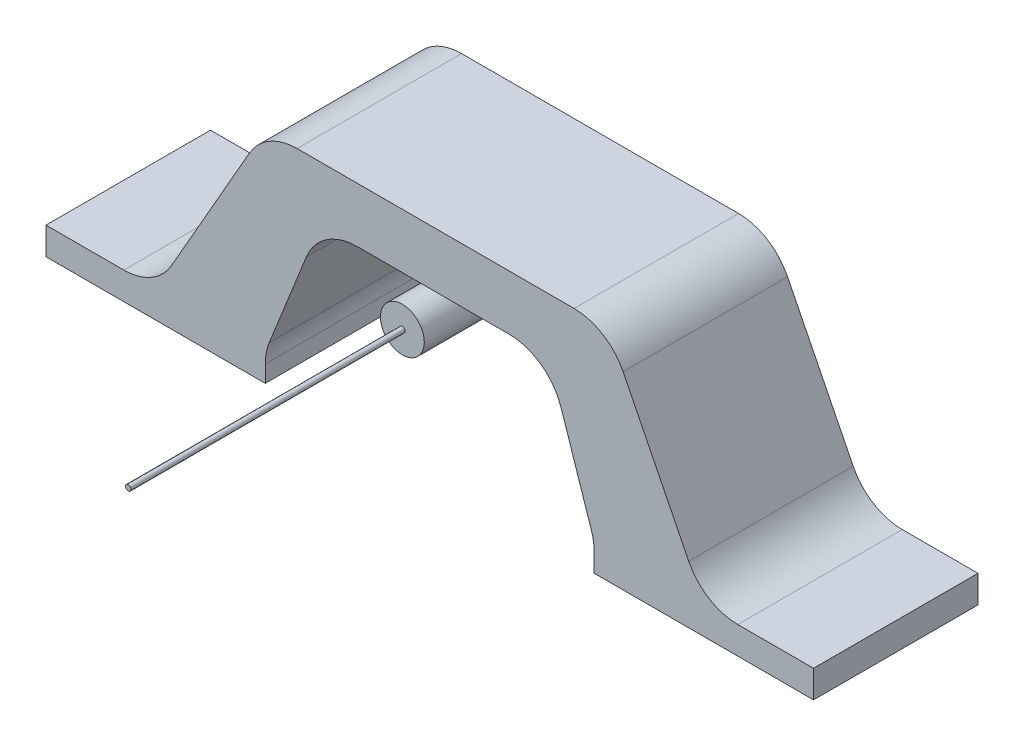
ISO-10303-21;
HEADER;
FILE_DESCRIPTION(('STEP AP214'),'2;1');
FILE_NAME('part.step','',(''),(''),'','','');
FILE_SCHEMA(('AUTOMOTIVE_DESIGN { 1 0 10303 214 1 1 1 1 }'));
ENDSEC;
DATA;
#1=APPLICATION_CONTEXT('core data for automotive mechanical design processes');
#2=APPLICATION_PROTOCOL_DEFINITION('international standard','automotive_design',2000,#1);
#3=PRODUCT_CONTEXT('',#1,'mechanical');
#4=PRODUCT('Part','Part','',(#3));
#5=PRODUCT_RELATED_PRODUCT_CATEGORY('part','',(#4));
#6=PRODUCT_DEFINITION_FORMATION('','',#4);
#7=PRODUCT_DEFINITION_CONTEXT('part definition',#1,'design');
#8=PRODUCT_DEFINITION('design','',#6,#7);
#9=PRODUCT_DEFINITION_SHAPE('','',#8);
#10=(LENGTH_UNIT() NAMED_UNIT(*) SI_UNIT(.MILLI.,.METRE.));
#11=(NAMED_UNIT(*) PLANE_ANGLE_UNIT() SI_UNIT($,.RADIAN.));
#12=(NAMED_UNIT(*) SI_UNIT($,.STERADIAN.) SOLID_ANGLE_UNIT());
#13=UNCERTAINTY_MEASURE_WITH_UNIT(LENGTH_MEASURE(1.E-05),#10,'distance_accuracy_value','');
#14=(GEOMETRIC_REPRESENTATION_CONTEXT(3) GLOBAL_UNCERTAINTY_ASSIGNED_CONTEXT((#13)) GLOBAL_UNIT_ASSIGNED_CONTEXT((#10,
#11,#12)) REPRESENTATION_CONTEXT('',''));
#15=CARTESIAN_POINT('',(0.,0.,0.));
#16=DIRECTION('',(0.,0.,1.));
#17=DIRECTION('',(1.,0.,0.));
#18=AXIS2_PLACEMENT_3D('',#15,#16,#17);
#19=CARTESIAN_POINT('',(0.,26.,35.));
#20=DIRECTION('',(0.,0.,-1.));
#21=DIRECTION('',(-1.,0.,0.));
#22=AXIS2_PLACEMENT_3D('',#19,#20,#21);
#23=CYLINDRICAL_SURFACE('',#22,4.);
#24=CARTESIAN_POINT('',(0.,26.,35.));
#25=DIRECTION('',(0.,0.,1.));
#26=DIRECTION('',(1.,0.,0.));
#27=AXIS2_PLACEMENT_3D('',#24,#25,#26);
#28=CIRCLE('',#27,4.);
#29=CARTESIAN_POINT('',(4.,26.,35.));
#30=VERTEX_POINT('',#29);
#31=EDGE_CURVE('E11',#30,#30,#28,.T.);
#32=ORIENTED_EDGE('',*,*,#31,.F.);
#33=EDGE_LOOP('',(#32));
#34=FACE_BOUND('',#33,.T.);
#35=CARTESIAN_POINT('',(0.,26.,0.));
#36=DIRECTION('',(0.,0.,1.));
#37=DIRECTION('',(1.,0.,0.));
#38=AXIS2_PLACEMENT_3D('',#35,#36,#37);
#39=CIRCLE('',#38,4.);
#40=CARTESIAN_POINT('',(4.,26.,0.));
#41=VERTEX_POINT('',#40);
#42=EDGE_CURVE('E50',#41,#41,#39,.T.);
#43=ORIENTED_EDGE('',*,*,#42,.T.);
#44=EDGE_LOOP('',(#43));
#45=FACE_BOUND('',#44,.T.);
#46=ADVANCED_FACE('F47',(#34,#45),#23,.T.);
#47=CARTESIAN_POINT('',(0.,26.,35.));
#48=DIRECTION('',(0.,0.,1.));
#49=DIRECTION('',(1.,0.,0.));
#50=AXIS2_PLACEMENT_3D('',#47,#48,#49);
#51=PLANE('',#50);
#52=CARTESIAN_POINT('',(0.,26.,35.));
#53=DIRECTION('',(0.,0.,1.));
#54=DIRECTION('',(1.,0.,0.));
#55=AXIS2_PLACEMENT_3D('',#52,#53,#54);
#56=CIRCLE('',#55,0.5);
#57=CARTESIAN_POINT('',(0.5,26.,35.));
#58=VERTEX_POINT('',#57);
#59=EDGE_CURVE('E59',#58,#58,#56,.T.);
#60=ORIENTED_EDGE('',*,*,#59,.F.);
#61=EDGE_LOOP('',(#60));
#62=FACE_BOUND('',#61,.T.);
#63=ORIENTED_EDGE('',*,*,#31,.T.);
#64=EDGE_LOOP('',(#63));
#65=FACE_BOUND('',#64,.T.);
#66=ADVANCED_FACE('F74',(#62,#65),#51,.T.);
#67=CARTESIAN_POINT('',(0.,26.,0.));
#68=DIRECTION('',(0.,0.,1.));
#69=DIRECTION('',(1.,0.,0.));
#70=AXIS2_PLACEMENT_3D('',#67,#68,#69);
#71=PLANE('',#70);
#72=ORIENTED_EDGE('',*,*,#42,.F.);
#73=EDGE_LOOP('',(#72));
#74=FACE_BOUND('',#73,.T.);
#75=ADVANCED_FACE('F70',(#74),#71,.F.);
#76=CARTESIAN_POINT('',(0.,26.,85.));
#77=DIRECTION('',(0.,0.,-1.));
#78=DIRECTION('',(-1.,0.,0.));
#79=AXIS2_PLACEMENT_3D('',#76,#77,#78);
#80=CYLINDRICAL_SURFACE('',#79,0.5);
#81=CARTESIAN_POINT('',(0.,26.,85.));
#82=DIRECTION('',(0.,0.,1.));
#83=DIRECTION('',(1.,0.,0.));
#84=AXIS2_PLACEMENT_3D('',#81,#82,#83);
#85=CIRCLE('',#84,0.5);
#86=CARTESIAN_POINT('',(0.5,26.,85.));
#87=VERTEX_POINT('',#86);
#88=EDGE_CURVE('E57',#87,#87,#85,.T.);
#89=ORIENTED_EDGE('',*,*,#88,.F.);
#90=EDGE_LOOP('',(#89));
#91=FACE_BOUND('',#90,.T.);
#92=ORIENTED_EDGE('',*,*,#59,.T.);
#93=EDGE_LOOP('',(#92));
#94=FACE_BOUND('',#93,.T.);
#95=ADVANCED_FACE('F67',(#91,#94),#80,.T.);
#96=CARTESIAN_POINT('',(0.,26.,85.));
#97=DIRECTION('',(0.,0.,1.));
#98=DIRECTION('',(1.,0.,0.));
#99=AXIS2_PLACEMENT_3D('',#96,#97,#98);
#100=PLANE('',#99);
#101=ORIENTED_EDGE('',*,*,#88,.T.);
#102=EDGE_LOOP('',(#101));
#103=FACE_BOUND('',#102,.T.);
#104=ADVANCED_FACE('F65',(#103),#100,.T.);
#105=CLOSED_SHELL('',(#46,#66,#75,#95,#104));
#106=MANIFOLD_SOLID_BREP('B2',#105);
#107=CARTESIAN_POINT('',(-30.,5.00000000000001,30.));
#108=DIRECTION('',(0.,-1.,0.));
#109=DIRECTION('',(0.,0.,-1.));
#110=AXIS2_PLACEMENT_3D('',#107,#108,#109);
#111=PLANE('',#110);
#112=DIRECTION('',(-1.,0.,0.));
#113=VECTOR('',#112,1.);
#114=CARTESIAN_POINT('',(-30.,5.00000000000001,30.));
#115=LINE('',#114,#113);
#116=CARTESIAN_POINT('',(-55.8032253547122,5.00000000000001,30.));
#117=VERTEX_POINT('',#116);
#118=CARTESIAN_POINT('',(-70.,5.00000000000001,30.));
#119=VERTEX_POINT('',#118);
#120=EDGE_CURVE('E352',#117,#119,#115,.T.);
#121=ORIENTED_EDGE('',*,*,#120,.F.);
#122=DIRECTION('',(0.,0.,-1.));
#123=VECTOR('',#122,1.);
#124=CARTESIAN_POINT('',(-55.8032253547122,5.00000000000001,0.));
#125=LINE('',#124,#123);
#126=CARTESIAN_POINT('',(-55.8032253547122,5.00000000000001,0.));
#127=VERTEX_POINT('',#126);
#128=EDGE_CURVE('E447',#117,#127,#125,.T.);
#129=ORIENTED_EDGE('',*,*,#128,.T.);
#130=DIRECTION('',(-1.,0.,0.));
#131=VECTOR('',#130,1.);
#132=CARTESIAN_POINT('',(-30.,5.00000000000001,0.));
#133=LINE('',#132,#131);
#134=CARTESIAN_POINT('',(-70.,5.00000000000001,0.));
#135=VERTEX_POINT('',#134);
#136=EDGE_CURVE('E366',#127,#135,#133,.T.);
#137=ORIENTED_EDGE('',*,*,#136,.T.);
#138=DIRECTION('',(0.,0.,-1.));
#139=VECTOR('',#138,1.);
#140=CARTESIAN_POINT('',(-70.,5.00000000000001,30.));
#141=LINE('',#140,#139);
#142=EDGE_CURVE('E381',#119,#135,#141,.T.);
#143=ORIENTED_EDGE('',*,*,#142,.F.);
#144=EDGE_LOOP('',(#121,#129,#137,#143));
#145=FACE_BOUND('',#144,.T.);
#146=ADVANCED_FACE('F118',(#145),#111,.F.);
#147=CARTESIAN_POINT('',(-30.,0.,30.));
#148=DIRECTION('',(-1.,0.,0.));
#149=DIRECTION('',(0.,0.,1.));
#150=AXIS2_PLACEMENT_3D('',#147,#148,#149);
#151=PLANE('',#150);
#152=DIRECTION('',(0.,1.,0.));
#153=VECTOR('',#152,1.);
#154=CARTESIAN_POINT('',(-30.,0.,0.));
#155=LINE('',#154,#153);
#156=CARTESIAN_POINT('',(-30.,0.,0.));
#157=VERTEX_POINT('',#156);
#158=CARTESIAN_POINT('',(-30.,3.07417596432749,0.));
#159=VERTEX_POINT('',#158);
#160=EDGE_CURVE('E329',#157,#159,#155,.T.);
#161=ORIENTED_EDGE('',*,*,#160,.T.);
#162=DIRECTION('',(0.,0.,-1.));
#163=VECTOR('',#162,1.);
#164=CARTESIAN_POINT('',(-30.,3.07417596432749,30.));
#165=LINE('',#164,#163);
#166=CARTESIAN_POINT('',(-30.,3.07417596432749,30.));
#167=VERTEX_POINT('',#166);
#168=EDGE_CURVE('E392',#159,#167,#165,.F.);
#169=ORIENTED_EDGE('',*,*,#168,.T.);
#170=DIRECTION('',(0.,1.,0.));
#171=VECTOR('',#170,1.);
#172=CARTESIAN_POINT('',(-30.,0.,30.));
#173=LINE('',#172,#171);
#174=CARTESIAN_POINT('',(-30.,0.,30.));
#175=VERTEX_POINT('',#174);
#176=EDGE_CURVE('E348',#175,#167,#173,.T.);
#177=ORIENTED_EDGE('',*,*,#176,.F.);
#178=DIRECTION('',(0.,0.,-1.));
#179=VECTOR('',#178,1.);
#180=CARTESIAN_POINT('',(-30.,0.,30.));
#181=LINE('',#180,#179);
#182=EDGE_CURVE('E362',#175,#157,#181,.T.);
#183=ORIENTED_EDGE('',*,*,#182,.T.);
#184=EDGE_LOOP('',(#161,#169,#177,#183));
#185=FACE_BOUND('',#184,.T.);
#186=ADVANCED_FACE('F506',(#185),#151,.F.);
#187=CARTESIAN_POINT('',(-70.,0.,30.));
#188=DIRECTION('',(1.,0.,0.));
#189=DIRECTION('',(0.,0.,-1.));
#190=AXIS2_PLACEMENT_3D('',#187,#188,#189);
#191=PLANE('',#190);
#192=DIRECTION('',(0.,-1.,0.));
#193=VECTOR('',#192,1.);
#194=CARTESIAN_POINT('',(-70.,0.,0.));
#195=LINE('',#194,#193);
#196=CARTESIAN_POINT('',(-70.,0.,0.));
#197=VERTEX_POINT('',#196);
#198=EDGE_CURVE('E369',#135,#197,#195,.T.);
#199=ORIENTED_EDGE('',*,*,#198,.T.);
#200=DIRECTION('',(0.,0.,-1.));
#201=VECTOR('',#200,1.);
#202=CARTESIAN_POINT('',(-70.,0.,30.));
#203=LINE('',#202,#201);
#204=CARTESIAN_POINT('',(-70.,0.,30.));
#205=VERTEX_POINT('',#204);
#206=EDGE_CURVE('E377',#205,#197,#203,.T.);
#207=ORIENTED_EDGE('',*,*,#206,.F.);
#208=DIRECTION('',(0.,-1.,0.));
#209=VECTOR('',#208,1.);
#210=CARTESIAN_POINT('',(-70.,0.,30.));
#211=LINE('',#210,#209);
#212=EDGE_CURVE('E356',#119,#205,#211,.T.);
#213=ORIENTED_EDGE('',*,*,#212,.F.);
#214=ORIENTED_EDGE('',*,*,#142,.T.);
#215=EDGE_LOOP('',(#199,#207,#213,#214));
#216=FACE_BOUND('',#215,.T.);
#217=ADVANCED_FACE('F499',(#216),#191,.F.);
#218=CARTESIAN_POINT('',(-30.,0.,30.));
#219=DIRECTION('',(0.,1.,0.));
#220=DIRECTION('',(0.,0.,1.));
#221=AXIS2_PLACEMENT_3D('',#218,#219,#220);
#222=PLANE('',#221);
#223=DIRECTION('',(1.,0.,0.));
#224=VECTOR('',#223,1.);
#225=CARTESIAN_POINT('',(-30.,0.,0.));
#226=LINE('',#225,#224);
#227=EDGE_CURVE('E353',#197,#157,#226,.T.);
#228=ORIENTED_EDGE('',*,*,#227,.T.);
#229=ORIENTED_EDGE('',*,*,#182,.F.);
#230=DIRECTION('',(1.,0.,0.));
#231=VECTOR('',#230,1.);
#232=CARTESIAN_POINT('',(-30.,0.,30.));
#233=LINE('',#232,#231);
#234=EDGE_CURVE('E359',#205,#175,#233,.T.);
#235=ORIENTED_EDGE('',*,*,#234,.F.);
#236=ORIENTED_EDGE('',*,*,#206,.T.);
#237=EDGE_LOOP('',(#228,#229,#235,#236));
#238=FACE_BOUND('',#237,.T.);
#239=ADVANCED_FACE('F502',(#238),#222,.F.);
#240=CARTESIAN_POINT('',(0.,0.,30.));
#241=DIRECTION('',(0.,0.,1.));
#242=DIRECTION('',(1.,0.,0.));
#243=AXIS2_PLACEMENT_3D('',#240,#241,#242);
#244=PLANE('',#243);
#245=DIRECTION('',(-1.,0.,0.));
#246=VECTOR('',#245,1.);
#247=CARTESIAN_POINT('',(32.5,40.,30.));
#248=LINE('',#247,#246);
#249=CARTESIAN_POINT('',(26.319660112501,40.,30.));
#250=VERTEX_POINT('',#249);
#251=CARTESIAN_POINT('',(-24.1967746452878,40.,30.));
#252=VERTEX_POINT('',#251);
#253=EDGE_CURVE('E324',#250,#252,#248,.T.);
#254=ORIENTED_EDGE('',*,*,#253,.T.);
#255=CARTESIAN_POINT('',(-24.1967746452878,30.,30.));
#256=DIRECTION('',(0.,0.,1.));
#257=DIRECTION('',(1.,0.,0.));
#258=AXIS2_PLACEMENT_3D('',#255,#256,#257);
#259=CIRCLE('',#258,10.);
#260=CARTESIAN_POINT('',(-32.8792060665324,34.9613893835683,30.));
#261=VERTEX_POINT('',#260);
#262=EDGE_CURVE('E435',#252,#261,#259,.T.);
#263=ORIENTED_EDGE('',*,*,#262,.T.);
#264=DIRECTION('',(-0.496138938356834,-0.868243142124459,0.));
#265=VECTOR('',#264,1.);
#266=CARTESIAN_POINT('',(-30.,40.,30.));
#267=LINE('',#266,#265);
#268=CARTESIAN_POINT('',(-47.1207939334676,10.0386106164317,30.));
#269=VERTEX_POINT('',#268);
#270=EDGE_CURVE('E327',#261,#269,#267,.T.);
#271=ORIENTED_EDGE('',*,*,#270,.T.);
#272=CARTESIAN_POINT('',(-55.8032253547122,15.,30.));
#273=DIRECTION('',(0.,0.,1.));
#274=DIRECTION('',(1.,0.,0.));
#275=AXIS2_PLACEMENT_3D('',#272,#273,#274);
#276=CIRCLE('',#275,10.);
#277=EDGE_CURVE('E45',#269,#117,#276,.F.);
#278=ORIENTED_EDGE('',*,*,#277,.T.);
#279=ORIENTED_EDGE('',*,*,#120,.T.);
#280=ORIENTED_EDGE('',*,*,#212,.T.);
#281=ORIENTED_EDGE('',*,*,#234,.T.);
#282=ORIENTED_EDGE('',*,*,#176,.T.);
#283=CARTESIAN_POINT('',(-20.,3.07417596432749,30.));
#284=DIRECTION('',(0.,0.,1.));
#285=DIRECTION('',(1.,0.,0.));
#286=AXIS2_PLACEMENT_3D('',#283,#284,#285);
#287=CIRCLE('',#286,10.);
#288=CARTESIAN_POINT('',(-29.2847669088526,6.78808272786853,30.));
#289=VERTEX_POINT('',#288);
#290=EDGE_CURVE('E454',#167,#289,#287,.F.);
#291=ORIENTED_EDGE('',*,*,#290,.T.);
#292=DIRECTION('',(0.371390676354104,0.928476690885259,0.));
#293=VECTOR('',#292,1.);
#294=CARTESIAN_POINT('',(-30.,5.00000000000001,30.));
#295=LINE('',#294,#293);
#296=CARTESIAN_POINT('',(-22.5144372945836,23.713906763541,30.));
#297=VERTEX_POINT('',#296);
#298=EDGE_CURVE('E309',#289,#297,#295,.T.);
#299=ORIENTED_EDGE('',*,*,#298,.T.);
#300=CARTESIAN_POINT('',(-13.229670385731,20.,30.));
#301=DIRECTION('',(0.,0.,1.));
#302=DIRECTION('',(1.,0.,0.));
#303=AXIS2_PLACEMENT_3D('',#300,#301,#302);
#304=CIRCLE('',#303,10.);
#305=CARTESIAN_POINT('',(-13.229670385731,30.,30.));
#306=VERTEX_POINT('',#305);
#307=EDGE_CURVE('E471',#297,#306,#304,.F.);
#308=ORIENTED_EDGE('',*,*,#307,.T.);
#309=DIRECTION('',(1.,0.,0.));
#310=VECTOR('',#309,1.);
#311=CARTESIAN_POINT('',(-20.,30.,30.));
#312=LINE('',#311,#310);
#313=CARTESIAN_POINT('',(14.4590744661054,30.,30.));
#314=VERTEX_POINT('',#313);
#315=EDGE_CURVE('E313',#306,#314,#312,.T.);
#316=ORIENTED_EDGE('',*,*,#315,.T.);
#317=CARTESIAN_POINT('',(14.4590744661054,20.,30.));
#318=DIRECTION('',(0.,0.,1.));
#319=DIRECTION('',(1.,0.,0.));
#320=AXIS2_PLACEMENT_3D('',#317,#318,#319);
#321=CIRCLE('',#320,10.);
#322=CARTESIAN_POINT('',(23.9459074466105,23.1622776601684,30.));
#323=VERTEX_POINT('',#322);
#324=EDGE_CURVE('E465',#314,#323,#321,.F.);
#325=ORIENTED_EDGE('',*,*,#324,.T.);
#326=DIRECTION('',(0.316227766016838,-0.948683298050514,0.));
#327=VECTOR('',#326,1.);
#328=CARTESIAN_POINT('',(21.6666666666667,30.,30.));
#329=LINE('',#328,#327);
#330=CARTESIAN_POINT('',(29.4868329805051,6.5395010584846,30.));
#331=VERTEX_POINT('',#330);
#332=EDGE_CURVE('E318',#323,#331,#329,.T.);
#333=ORIENTED_EDGE('',*,*,#332,.T.);
#334=CARTESIAN_POINT('',(20.,3.37722339831622,30.));
#335=DIRECTION('',(0.,0.,1.));
#336=DIRECTION('',(1.,0.,0.));
#337=AXIS2_PLACEMENT_3D('',#334,#335,#336);
#338=CIRCLE('',#337,10.);
#339=CARTESIAN_POINT('',(30.,3.37722339831622,30.));
#340=VERTEX_POINT('',#339);
#341=EDGE_CURVE('E275',#331,#340,#338,.F.);
#342=ORIENTED_EDGE('',*,*,#341,.T.);
#343=DIRECTION('',(0.,-1.,0.));
#344=VECTOR('',#343,1.);
#345=CARTESIAN_POINT('',(30.,0.,30.));
#346=LINE('',#345,#344);
#347=CARTESIAN_POINT('',(30.,0.,30.));
#348=VERTEX_POINT('',#347);
#349=EDGE_CURVE('E267',#340,#348,#346,.T.);
#350=ORIENTED_EDGE('',*,*,#349,.T.);
#351=DIRECTION('',(1.,0.,0.));
#352=VECTOR('',#351,1.);
#353=CARTESIAN_POINT('',(30.,0.,30.));
#354=LINE('',#353,#352);
#355=CARTESIAN_POINT('',(70.,0.,30.));
#356=VERTEX_POINT('',#355);
#357=EDGE_CURVE('E271',#348,#356,#354,.T.);
#358=ORIENTED_EDGE('',*,*,#357,.T.);
#359=DIRECTION('',(0.,1.,0.));
#360=VECTOR('',#359,1.);
#361=CARTESIAN_POINT('',(70.,0.,30.));
#362=LINE('',#361,#360);
#363=CARTESIAN_POINT('',(70.,5.,30.));
#364=VERTEX_POINT('',#363);
#365=EDGE_CURVE('E291',#356,#364,#362,.T.);
#366=ORIENTED_EDGE('',*,*,#365,.T.);
#367=DIRECTION('',(-1.,0.,0.));
#368=VECTOR('',#367,1.);
#369=CARTESIAN_POINT('',(30.,5.,30.));
#370=LINE('',#369,#368);
#371=CARTESIAN_POINT('',(56.1803398874989,5.,30.));
#372=VERTEX_POINT('',#371);
#373=EDGE_CURVE('E604',#364,#372,#370,.T.);
#374=ORIENTED_EDGE('',*,*,#373,.T.);
#375=CARTESIAN_POINT('',(56.1803398874989,15.,30.));
#376=DIRECTION('',(0.,0.,1.));
#377=DIRECTION('',(1.,0.,0.));
#378=AXIS2_PLACEMENT_3D('',#375,#376,#377);
#379=CIRCLE('',#378,10.);
#380=CARTESIAN_POINT('',(47.2360679774998,10.5278640450004,30.));
#381=VERTEX_POINT('',#380);
#382=EDGE_CURVE('E477',#372,#381,#379,.F.);
#383=ORIENTED_EDGE('',*,*,#382,.T.);
#384=DIRECTION('',(-0.447213595499958,0.894427190999916,0.));
#385=VECTOR('',#384,1.);
#386=CARTESIAN_POINT('',(50.,5.,30.));
#387=LINE('',#386,#385);
#388=CARTESIAN_POINT('',(35.2639320225002,34.4721359549996,30.));
#389=VERTEX_POINT('',#388);
#390=EDGE_CURVE('E321',#381,#389,#387,.T.);
#391=ORIENTED_EDGE('',*,*,#390,.T.);
#392=CARTESIAN_POINT('',(26.319660112501,30.,30.));
#393=DIRECTION('',(0.,0.,1.));
#394=DIRECTION('',(1.,0.,0.));
#395=AXIS2_PLACEMENT_3D('',#392,#393,#394);
#396=CIRCLE('',#395,10.);
#397=EDGE_CURVE('E432',#389,#250,#396,.T.);
#398=ORIENTED_EDGE('',*,*,#397,.T.);
#399=EDGE_LOOP('',(#254,#263,#271,#278,#279,#280,#281,#282,#291,#299,#308,#316,#325,#333,#342,
#350,#358,#366,#374,#383,#391,#398));
#400=FACE_BOUND('',#399,.T.);
#401=ADVANCED_FACE('F270',(#400),#244,.T.);
#402=CARTESIAN_POINT('',(0.,0.,0.));
#403=DIRECTION('',(0.,0.,1.));
#404=DIRECTION('',(1.,0.,0.));
#405=AXIS2_PLACEMENT_3D('',#402,#403,#404);
#406=PLANE('',#405);
#407=DIRECTION('',(-0.496138938356834,-0.868243142124459,0.));
#408=VECTOR('',#407,1.);
#409=CARTESIAN_POINT('',(-30.,40.,0.));
#410=LINE('',#409,#408);
#411=CARTESIAN_POINT('',(-32.8792060665324,34.9613893835683,0.));
#412=VERTEX_POINT('',#411);
#413=CARTESIAN_POINT('',(-47.1207939334676,10.0386106164317,0.));
#414=VERTEX_POINT('',#413);
#415=EDGE_CURVE('E314',#412,#414,#410,.T.);
#416=ORIENTED_EDGE('',*,*,#415,.F.);
#417=CARTESIAN_POINT('',(-24.1967746452878,30.,0.));
#418=DIRECTION('',(0.,0.,1.));
#419=DIRECTION('',(1.,0.,0.));
#420=AXIS2_PLACEMENT_3D('',#417,#418,#419);
#421=CIRCLE('',#420,10.);
#422=CARTESIAN_POINT('',(-24.1967746452878,40.,0.));
#423=VERTEX_POINT('',#422);
#424=EDGE_CURVE('E422',#412,#423,#421,.F.);
#425=ORIENTED_EDGE('',*,*,#424,.T.);
#426=DIRECTION('',(-1.,0.,0.));
#427=VECTOR('',#426,1.);
#428=CARTESIAN_POINT('',(32.5,40.,0.));
#429=LINE('',#428,#427);
#430=CARTESIAN_POINT('',(26.319660112501,40.,0.));
#431=VERTEX_POINT('',#430);
#432=EDGE_CURVE('E341',#431,#423,#429,.T.);
#433=ORIENTED_EDGE('',*,*,#432,.F.);
#434=CARTESIAN_POINT('',(26.319660112501,30.,0.));
#435=DIRECTION('',(0.,0.,1.));
#436=DIRECTION('',(1.,0.,0.));
#437=AXIS2_PLACEMENT_3D('',#434,#435,#436);
#438=CIRCLE('',#437,10.);
#439=CARTESIAN_POINT('',(35.2639320225002,34.4721359549996,0.));
#440=VERTEX_POINT('',#439);
#441=EDGE_CURVE('E419',#431,#440,#438,.F.);
#442=ORIENTED_EDGE('',*,*,#441,.T.);
#443=DIRECTION('',(-0.447213595499958,0.894427190999916,0.));
#444=VECTOR('',#443,1.);
#445=CARTESIAN_POINT('',(50.,5.,0.));
#446=LINE('',#445,#444);
#447=CARTESIAN_POINT('',(47.2360679774998,10.5278640450004,0.));
#448=VERTEX_POINT('',#447);
#449=EDGE_CURVE('E338',#448,#440,#446,.T.);
#450=ORIENTED_EDGE('',*,*,#449,.F.);
#451=CARTESIAN_POINT('',(56.1803398874989,15.,0.));
#452=DIRECTION('',(0.,0.,1.));
#453=DIRECTION('',(1.,0.,0.));
#454=AXIS2_PLACEMENT_3D('',#451,#452,#453);
#455=CIRCLE('',#454,10.);
#456=CARTESIAN_POINT('',(56.1803398874989,5.,0.));
#457=VERTEX_POINT('',#456);
#458=EDGE_CURVE('E474',#448,#457,#455,.T.);
#459=ORIENTED_EDGE('',*,*,#458,.T.);
#460=DIRECTION('',(-1.,0.,0.));
#461=VECTOR('',#460,1.);
#462=CARTESIAN_POINT('',(30.,5.,0.));
#463=LINE('',#462,#461);
#464=CARTESIAN_POINT('',(70.,5.,0.));
#465=VERTEX_POINT('',#464);
#466=EDGE_CURVE('E281',#465,#457,#463,.T.);
#467=ORIENTED_EDGE('',*,*,#466,.F.);
#468=DIRECTION('',(0.,1.,0.));
#469=VECTOR('',#468,1.);
#470=CARTESIAN_POINT('',(70.,0.,0.));
#471=LINE('',#470,#469);
#472=CARTESIAN_POINT('',(70.,0.,0.));
#473=VERTEX_POINT('',#472);
#474=EDGE_CURVE('E597',#473,#465,#471,.T.);
#475=ORIENTED_EDGE('',*,*,#474,.F.);
#476=DIRECTION('',(1.,0.,0.));
#477=VECTOR('',#476,1.);
#478=CARTESIAN_POINT('',(30.,0.,0.));
#479=LINE('',#478,#477);
#480=CARTESIAN_POINT('',(30.,0.,0.));
#481=VERTEX_POINT('',#480);
#482=EDGE_CURVE('E781',#481,#473,#479,.T.);
#483=ORIENTED_EDGE('',*,*,#482,.F.);
#484=DIRECTION('',(0.,-1.,0.));
#485=VECTOR('',#484,1.);
#486=CARTESIAN_POINT('',(30.,0.,0.));
#487=LINE('',#486,#485);
#488=CARTESIAN_POINT('',(30.,3.37722339831622,0.));
#489=VERTEX_POINT('',#488);
#490=EDGE_CURVE('E295',#489,#481,#487,.T.);
#491=ORIENTED_EDGE('',*,*,#490,.F.);
#492=CARTESIAN_POINT('',(20.,3.37722339831622,0.));
#493=DIRECTION('',(0.,0.,1.));
#494=DIRECTION('',(1.,0.,0.));
#495=AXIS2_PLACEMENT_3D('',#492,#493,#494);
#496=CIRCLE('',#495,10.);
#497=CARTESIAN_POINT('',(29.4868329805051,6.5395010584846,0.));
#498=VERTEX_POINT('',#497);
#499=EDGE_CURVE('E457',#489,#498,#496,.T.);
#500=ORIENTED_EDGE('',*,*,#499,.T.);
#501=DIRECTION('',(0.316227766016838,-0.948683298050514,0.));
#502=VECTOR('',#501,1.);
#503=CARTESIAN_POINT('',(21.6666666666667,30.,0.));
#504=LINE('',#503,#502);
#505=CARTESIAN_POINT('',(23.9459074466105,23.1622776601684,0.));
#506=VERTEX_POINT('',#505);
#507=EDGE_CURVE('E334',#506,#498,#504,.T.);
#508=ORIENTED_EDGE('',*,*,#507,.F.);
#509=CARTESIAN_POINT('',(14.4590744661054,20.,0.));
#510=DIRECTION('',(0.,0.,1.));
#511=DIRECTION('',(1.,0.,0.));
#512=AXIS2_PLACEMENT_3D('',#509,#510,#511);
#513=CIRCLE('',#512,10.);
#514=CARTESIAN_POINT('',(14.4590744661054,30.,0.));
#515=VERTEX_POINT('',#514);
#516=EDGE_CURVE('E462',#506,#515,#513,.T.);
#517=ORIENTED_EDGE('',*,*,#516,.T.);
#518=DIRECTION('',(1.,0.,0.));
#519=VECTOR('',#518,1.);
#520=CARTESIAN_POINT('',(-20.,30.,0.));
#521=LINE('',#520,#519);
#522=CARTESIAN_POINT('',(-13.229670385731,30.,0.));
#523=VERTEX_POINT('',#522);
#524=EDGE_CURVE('E303',#523,#515,#521,.T.);
#525=ORIENTED_EDGE('',*,*,#524,.F.);
#526=CARTESIAN_POINT('',(-13.229670385731,20.,0.));
#527=DIRECTION('',(0.,0.,1.));
#528=DIRECTION('',(1.,0.,0.));
#529=AXIS2_PLACEMENT_3D('',#526,#527,#528);
#530=CIRCLE('',#529,10.);
#531=CARTESIAN_POINT('',(-22.5144372945836,23.713906763541,0.));
#532=VERTEX_POINT('',#531);
#533=EDGE_CURVE('E468',#523,#532,#530,.T.);
#534=ORIENTED_EDGE('',*,*,#533,.T.);
#535=DIRECTION('',(0.371390676354104,0.928476690885259,0.));
#536=VECTOR('',#535,1.);
#537=CARTESIAN_POINT('',(-30.,5.00000000000001,0.));
#538=LINE('',#537,#536);
#539=CARTESIAN_POINT('',(-29.2847669088526,6.78808272786853,0.));
#540=VERTEX_POINT('',#539);
#541=EDGE_CURVE('E298',#540,#532,#538,.T.);
#542=ORIENTED_EDGE('',*,*,#541,.F.);
#543=CARTESIAN_POINT('',(-20.,3.07417596432749,0.));
#544=DIRECTION('',(0.,0.,1.));
#545=DIRECTION('',(1.,0.,0.));
#546=AXIS2_PLACEMENT_3D('',#543,#544,#545);
#547=CIRCLE('',#546,10.);
#548=EDGE_CURVE('E451',#540,#159,#547,.T.);
#549=ORIENTED_EDGE('',*,*,#548,.T.);
#550=ORIENTED_EDGE('',*,*,#160,.F.);
#551=ORIENTED_EDGE('',*,*,#227,.F.);
#552=ORIENTED_EDGE('',*,*,#198,.F.);
#553=ORIENTED_EDGE('',*,*,#136,.F.);
#554=CARTESIAN_POINT('',(-55.8032253547122,15.,0.));
#555=DIRECTION('',(0.,0.,1.));
#556=DIRECTION('',(1.,0.,0.));
#557=AXIS2_PLACEMENT_3D('',#554,#555,#556);
#558=CIRCLE('',#557,10.);
#559=EDGE_CURVE('E127',#127,#414,#558,.T.);
#560=ORIENTED_EDGE('',*,*,#559,.T.);
#561=EDGE_LOOP('',(#416,#425,#433,#442,#450,#459,#467,#475,#483,#491,#500,#508,#517,#525,#534,
#542,#549,#550,#551,#552,#553,#560));
#562=FACE_BOUND('',#561,.T.);
#563=ADVANCED_FACE('F483',(#562),#406,.F.);
#564=CARTESIAN_POINT('',(-30.,5.00000000000001,30.));
#565=DIRECTION('',(-0.928476690885259,0.371390676354104,0.));
#566=DIRECTION('',(-0.371390676354104,-0.928476690885259,0.));
#567=AXIS2_PLACEMENT_3D('',#564,#565,#566);
#568=PLANE('',#567);
#569=ORIENTED_EDGE('',*,*,#298,.F.);
#570=DIRECTION('',(0.,0.,-1.));
#571=VECTOR('',#570,1.);
#572=CARTESIAN_POINT('',(-29.2847669088526,6.78808272786853,0.));
#573=LINE('',#572,#571);
#574=EDGE_CURVE('E388',#289,#540,#573,.T.);
#575=ORIENTED_EDGE('',*,*,#574,.T.);
#576=ORIENTED_EDGE('',*,*,#541,.T.);
#577=DIRECTION('',(0.,0.,-1.));
#578=VECTOR('',#577,1.);
#579=CARTESIAN_POINT('',(-22.5144372945836,23.713906763541,30.));
#580=LINE('',#579,#578);
#581=EDGE_CURVE('E385',#532,#297,#580,.F.);
#582=ORIENTED_EDGE('',*,*,#581,.T.);
#583=EDGE_LOOP('',(#569,#575,#576,#582));
#584=FACE_BOUND('',#583,.T.);
#585=ADVANCED_FACE('F515',(#584),#568,.F.);
#586=CARTESIAN_POINT('',(-20.,30.,30.));
#587=DIRECTION('',(0.,1.,0.));
#588=DIRECTION('',(0.,0.,1.));
#589=AXIS2_PLACEMENT_3D('',#586,#587,#588);
#590=PLANE('',#589);
#591=ORIENTED_EDGE('',*,*,#524,.T.);
#592=DIRECTION('',(0.,0.,-1.));
#593=VECTOR('',#592,1.);
#594=CARTESIAN_POINT('',(14.4590744661054,30.,30.));
#595=LINE('',#594,#593);
#596=EDGE_CURVE('E409',#515,#314,#595,.F.);
#597=ORIENTED_EDGE('',*,*,#596,.T.);
#598=ORIENTED_EDGE('',*,*,#315,.F.);
#599=DIRECTION('',(0.,0.,-1.));
#600=VECTOR('',#599,1.);
#601=CARTESIAN_POINT('',(-13.229670385731,30.,0.));
#602=LINE('',#601,#600);
#603=EDGE_CURVE('E405',#306,#523,#602,.T.);
#604=ORIENTED_EDGE('',*,*,#603,.T.);
#605=EDGE_LOOP('',(#591,#597,#598,#604));
#606=FACE_BOUND('',#605,.T.);
#607=ADVANCED_FACE('F524',(#606),#590,.F.);
#608=CARTESIAN_POINT('',(21.6666666666667,30.,30.));
#609=DIRECTION('',(0.948683298050514,0.316227766016838,0.));
#610=DIRECTION('',(-0.316227766016838,0.948683298050514,0.));
#611=AXIS2_PLACEMENT_3D('',#608,#609,#610);
#612=PLANE('',#611);
#613=ORIENTED_EDGE('',*,*,#507,.T.);
#614=DIRECTION('',(0.,0.,-1.));
#615=VECTOR('',#614,1.);
#616=CARTESIAN_POINT('',(29.4868329805051,6.5395010584846,30.));
#617=LINE('',#616,#615);
#618=EDGE_CURVE('E402',#498,#331,#617,.F.);
#619=ORIENTED_EDGE('',*,*,#618,.T.);
#620=ORIENTED_EDGE('',*,*,#332,.F.);
#621=DIRECTION('',(0.,0.,-1.));
#622=VECTOR('',#621,1.);
#623=CARTESIAN_POINT('',(23.9459074466105,23.1622776601684,0.));
#624=LINE('',#623,#622);
#625=EDGE_CURVE('E398',#323,#506,#624,.T.);
#626=ORIENTED_EDGE('',*,*,#625,.T.);
#627=EDGE_LOOP('',(#613,#619,#620,#626));
#628=FACE_BOUND('',#627,.T.);
#629=ADVANCED_FACE('F533',(#628),#612,.F.);
#630=CARTESIAN_POINT('',(50.,5.,30.));
#631=DIRECTION('',(-0.894427190999916,-0.447213595499958,0.));
#632=DIRECTION('',(0.447213595499958,-0.894427190999916,0.));
#633=AXIS2_PLACEMENT_3D('',#630,#631,#632);
#634=PLANE('',#633);
#635=ORIENTED_EDGE('',*,*,#449,.T.);
#636=DIRECTION('',(0.,0.,-1.));
#637=VECTOR('',#636,1.);
#638=CARTESIAN_POINT('',(35.2639320225002,34.4721359549996,30.));
#639=LINE('',#638,#637);
#640=EDGE_CURVE('E140',#440,#389,#639,.F.);
#641=ORIENTED_EDGE('',*,*,#640,.T.);
#642=ORIENTED_EDGE('',*,*,#390,.F.);
#643=DIRECTION('',(0.,0.,-1.));
#644=VECTOR('',#643,1.);
#645=CARTESIAN_POINT('',(47.2360679774998,10.5278640450004,0.));
#646=LINE('',#645,#644);
#647=EDGE_CURVE('E438',#381,#448,#646,.T.);
#648=ORIENTED_EDGE('',*,*,#647,.T.);
#649=EDGE_LOOP('',(#635,#641,#642,#648));
#650=FACE_BOUND('',#649,.T.);
#651=ADVANCED_FACE('F567',(#650),#634,.F.);
#652=CARTESIAN_POINT('',(32.5,40.,30.));
#653=DIRECTION('',(0.,-1.,0.));
#654=DIRECTION('',(1.,0.,0.));
#655=AXIS2_PLACEMENT_3D('',#652,#653,#654);
#656=PLANE('',#655);
#657=ORIENTED_EDGE('',*,*,#432,.T.);
#658=DIRECTION('',(0.,0.,-1.));
#659=VECTOR('',#658,1.);
#660=CARTESIAN_POINT('',(-24.1967746452878,40.,30.));
#661=LINE('',#660,#659);
#662=EDGE_CURVE('E429',#423,#252,#661,.F.);
#663=ORIENTED_EDGE('',*,*,#662,.T.);
#664=ORIENTED_EDGE('',*,*,#253,.F.);
#665=DIRECTION('',(0.,0.,-1.));
#666=VECTOR('',#665,1.);
#667=CARTESIAN_POINT('',(26.319660112501,40.,30.));
#668=LINE('',#667,#666);
#669=EDGE_CURVE('E425',#250,#431,#668,.T.);
#670=ORIENTED_EDGE('',*,*,#669,.T.);
#671=EDGE_LOOP('',(#657,#663,#664,#670));
#672=FACE_BOUND('',#671,.T.);
#673=ADVANCED_FACE('F570',(#672),#656,.F.);
#674=CARTESIAN_POINT('',(-30.,40.,30.));
#675=DIRECTION('',(0.868243142124459,-0.496138938356834,0.));
#676=DIRECTION('',(0.496138938356834,0.868243142124459,0.));
#677=AXIS2_PLACEMENT_3D('',#674,#675,#676);
#678=PLANE('',#677);
#679=ORIENTED_EDGE('',*,*,#270,.F.);
#680=DIRECTION('',(0.,0.,-1.));
#681=VECTOR('',#680,1.);
#682=CARTESIAN_POINT('',(-32.8792060665324,34.9613893835683,30.));
#683=LINE('',#682,#681);
#684=EDGE_CURVE('E415',#261,#412,#683,.T.);
#685=ORIENTED_EDGE('',*,*,#684,.T.);
#686=ORIENTED_EDGE('',*,*,#415,.T.);
#687=DIRECTION('',(0.,0.,-1.));
#688=VECTOR('',#687,1.);
#689=CARTESIAN_POINT('',(-47.1207939334676,10.0386106164317,30.));
#690=LINE('',#689,#688);
#691=EDGE_CURVE('E412',#414,#269,#690,.F.);
#692=ORIENTED_EDGE('',*,*,#691,.T.);
#693=EDGE_LOOP('',(#679,#685,#686,#692));
#694=FACE_BOUND('',#693,.T.);
#695=ADVANCED_FACE('F490',(#694),#678,.F.);
#696=CARTESIAN_POINT('',(30.,5.,30.));
#697=DIRECTION('',(0.,-1.,0.));
#698=DIRECTION('',(0.,0.,-1.));
#699=AXIS2_PLACEMENT_3D('',#696,#697,#698);
#700=PLANE('',#699);
#701=ORIENTED_EDGE('',*,*,#466,.T.);
#702=DIRECTION('',(0.,0.,-1.));
#703=VECTOR('',#702,1.);
#704=CARTESIAN_POINT('',(56.1803398874989,5.,30.));
#705=LINE('',#704,#703);
#706=EDGE_CURVE('E444',#457,#372,#705,.F.);
#707=ORIENTED_EDGE('',*,*,#706,.T.);
#708=ORIENTED_EDGE('',*,*,#373,.F.);
#709=DIRECTION('',(0.,0.,-1.));
#710=VECTOR('',#709,1.);
#711=CARTESIAN_POINT('',(70.,5.,30.));
#712=LINE('',#711,#710);
#713=EDGE_CURVE('E305',#364,#465,#712,.T.);
#714=ORIENTED_EDGE('',*,*,#713,.T.);
#715=EDGE_LOOP('',(#701,#707,#708,#714));
#716=FACE_BOUND('',#715,.T.);
#717=ADVANCED_FACE('F576',(#716),#700,.F.);
#718=CARTESIAN_POINT('',(30.,0.,30.));
#719=DIRECTION('',(1.,0.,0.));
#720=DIRECTION('',(0.,0.,-1.));
#721=AXIS2_PLACEMENT_3D('',#718,#719,#720);
#722=PLANE('',#721);
#723=ORIENTED_EDGE('',*,*,#349,.F.);
#724=DIRECTION('',(0.,0.,-1.));
#725=VECTOR('',#724,1.);
#726=CARTESIAN_POINT('',(30.,3.37722339831622,0.));
#727=LINE('',#726,#725);
#728=EDGE_CURVE('E395',#340,#489,#727,.T.);
#729=ORIENTED_EDGE('',*,*,#728,.T.);
#730=ORIENTED_EDGE('',*,*,#490,.T.);
#731=DIRECTION('',(0.,0.,-1.));
#732=VECTOR('',#731,1.);
#733=CARTESIAN_POINT('',(30.,0.,30.));
#734=LINE('',#733,#732);
#735=EDGE_CURVE('E286',#348,#481,#734,.T.);
#736=ORIENTED_EDGE('',*,*,#735,.F.);
#737=EDGE_LOOP('',(#723,#729,#730,#736));
#738=FACE_BOUND('',#737,.T.);
#739=ADVANCED_FACE('F293',(#738),#722,.F.);
#740=CARTESIAN_POINT('',(30.,0.,30.));
#741=DIRECTION('',(0.,1.,0.));
#742=DIRECTION('',(0.,0.,1.));
#743=AXIS2_PLACEMENT_3D('',#740,#741,#742);
#744=PLANE('',#743);
#745=ORIENTED_EDGE('',*,*,#482,.T.);
#746=DIRECTION('',(0.,0.,-1.));
#747=VECTOR('',#746,1.);
#748=CARTESIAN_POINT('',(70.,0.,30.));
#749=LINE('',#748,#747);
#750=EDGE_CURVE('E288',#356,#473,#749,.T.);
#751=ORIENTED_EDGE('',*,*,#750,.F.);
#752=ORIENTED_EDGE('',*,*,#357,.F.);
#753=ORIENTED_EDGE('',*,*,#735,.T.);
#754=EDGE_LOOP('',(#745,#751,#752,#753));
#755=FACE_BOUND('',#754,.T.);
#756=ADVANCED_FACE('F285',(#755),#744,.F.);
#757=CARTESIAN_POINT('',(70.,0.,30.));
#758=DIRECTION('',(-1.,0.,0.));
#759=DIRECTION('',(0.,0.,1.));
#760=AXIS2_PLACEMENT_3D('',#757,#758,#759);
#761=PLANE('',#760);
#762=ORIENTED_EDGE('',*,*,#474,.T.);
#763=ORIENTED_EDGE('',*,*,#713,.F.);
#764=ORIENTED_EDGE('',*,*,#365,.F.);
#765=ORIENTED_EDGE('',*,*,#750,.T.);
#766=EDGE_LOOP('',(#762,#763,#764,#765));
#767=FACE_BOUND('',#766,.T.);
#768=ADVANCED_FACE('F544',(#767),#761,.F.);
#769=CARTESIAN_POINT('',(-20.,3.07417596432749,30.));
#770=DIRECTION('',(0.,0.,1.));
#771=DIRECTION('',(1.,0.,0.));
#772=AXIS2_PLACEMENT_3D('',#769,#770,#771);
#773=CYLINDRICAL_SURFACE('',#772,10.);
#774=ORIENTED_EDGE('',*,*,#290,.F.);
#775=ORIENTED_EDGE('',*,*,#168,.F.);
#776=ORIENTED_EDGE('',*,*,#548,.F.);
#777=ORIENTED_EDGE('',*,*,#574,.F.);
#778=EDGE_LOOP('',(#774,#775,#776,#777));
#779=FACE_BOUND('',#778,.T.);
#780=ADVANCED_FACE('F512',(#779),#773,.F.);
#781=CARTESIAN_POINT('',(20.,3.37722339831622,30.));
#782=DIRECTION('',(0.,0.,1.));
#783=DIRECTION('',(1.,0.,0.));
#784=AXIS2_PLACEMENT_3D('',#781,#782,#783);
#785=CYLINDRICAL_SURFACE('',#784,10.);
#786=ORIENTED_EDGE('',*,*,#341,.F.);
#787=ORIENTED_EDGE('',*,*,#618,.F.);
#788=ORIENTED_EDGE('',*,*,#499,.F.);
#789=ORIENTED_EDGE('',*,*,#728,.F.);
#790=EDGE_LOOP('',(#786,#787,#788,#789));
#791=FACE_BOUND('',#790,.T.);
#792=ADVANCED_FACE('F536',(#791),#785,.F.);
#793=CARTESIAN_POINT('',(14.4590744661054,20.,30.));
#794=DIRECTION('',(0.,0.,1.));
#795=DIRECTION('',(1.,0.,0.));
#796=AXIS2_PLACEMENT_3D('',#793,#794,#795);
#797=CYLINDRICAL_SURFACE('',#796,10.);
#798=ORIENTED_EDGE('',*,*,#324,.F.);
#799=ORIENTED_EDGE('',*,*,#596,.F.);
#800=ORIENTED_EDGE('',*,*,#516,.F.);
#801=ORIENTED_EDGE('',*,*,#625,.F.);
#802=EDGE_LOOP('',(#798,#799,#800,#801));
#803=FACE_BOUND('',#802,.T.);
#804=ADVANCED_FACE('F530',(#803),#797,.F.);
#805=CARTESIAN_POINT('',(-13.229670385731,20.,30.));
#806=DIRECTION('',(0.,0.,1.));
#807=DIRECTION('',(1.,0.,0.));
#808=AXIS2_PLACEMENT_3D('',#805,#806,#807);
#809=CYLINDRICAL_SURFACE('',#808,10.);
#810=ORIENTED_EDGE('',*,*,#307,.F.);
#811=ORIENTED_EDGE('',*,*,#581,.F.);
#812=ORIENTED_EDGE('',*,*,#533,.F.);
#813=ORIENTED_EDGE('',*,*,#603,.F.);
#814=EDGE_LOOP('',(#810,#811,#812,#813));
#815=FACE_BOUND('',#814,.T.);
#816=ADVANCED_FACE('F521',(#815),#809,.F.);
#817=CARTESIAN_POINT('',(-24.1967746452878,30.,30.));
#818=DIRECTION('',(0.,0.,-1.));
#819=DIRECTION('',(-1.,0.,0.));
#820=AXIS2_PLACEMENT_3D('',#817,#818,#819);
#821=CYLINDRICAL_SURFACE('',#820,10.);
#822=ORIENTED_EDGE('',*,*,#262,.F.);
#823=ORIENTED_EDGE('',*,*,#662,.F.);
#824=ORIENTED_EDGE('',*,*,#424,.F.);
#825=ORIENTED_EDGE('',*,*,#684,.F.);
#826=EDGE_LOOP('',(#822,#823,#824,#825));
#827=FACE_BOUND('',#826,.T.);
#828=ADVANCED_FACE('F614',(#827),#821,.T.);
#829=CARTESIAN_POINT('',(26.319660112501,30.,30.));
#830=DIRECTION('',(0.,0.,-1.));
#831=DIRECTION('',(-1.,0.,0.));
#832=AXIS2_PLACEMENT_3D('',#829,#830,#831);
#833=CYLINDRICAL_SURFACE('',#832,10.);
#834=ORIENTED_EDGE('',*,*,#397,.F.);
#835=ORIENTED_EDGE('',*,*,#640,.F.);
#836=ORIENTED_EDGE('',*,*,#441,.F.);
#837=ORIENTED_EDGE('',*,*,#669,.F.);
#838=EDGE_LOOP('',(#834,#835,#836,#837));
#839=FACE_BOUND('',#838,.T.);
#840=ADVANCED_FACE('F609',(#839),#833,.T.);
#841=CARTESIAN_POINT('',(56.1803398874989,15.,30.));
#842=DIRECTION('',(0.,0.,1.));
#843=DIRECTION('',(1.,0.,0.));
#844=AXIS2_PLACEMENT_3D('',#841,#842,#843);
#845=CYLINDRICAL_SURFACE('',#844,10.);
#846=ORIENTED_EDGE('',*,*,#382,.F.);
#847=ORIENTED_EDGE('',*,*,#706,.F.);
#848=ORIENTED_EDGE('',*,*,#458,.F.);
#849=ORIENTED_EDGE('',*,*,#647,.F.);
#850=EDGE_LOOP('',(#846,#847,#848,#849));
#851=FACE_BOUND('',#850,.T.);
#852=ADVANCED_FACE('F601',(#851),#845,.F.);
#853=CARTESIAN_POINT('',(-55.8032253547122,15.,30.));
#854=DIRECTION('',(0.,0.,1.));
#855=DIRECTION('',(1.,0.,0.));
#856=AXIS2_PLACEMENT_3D('',#853,#854,#855);
#857=CYLINDRICAL_SURFACE('',#856,10.);
#858=ORIENTED_EDGE('',*,*,#277,.F.);
#859=ORIENTED_EDGE('',*,*,#691,.F.);
#860=ORIENTED_EDGE('',*,*,#559,.F.);
#861=ORIENTED_EDGE('',*,*,#128,.F.);
#862=EDGE_LOOP('',(#858,#859,#860,#861));
#863=FACE_BOUND('',#862,.T.);
#864=ADVANCED_FACE('F120',(#863),#857,.F.);
#865=CLOSED_SHELL('',(#146,#186,#217,#239,#401,#563,#585,#607,#629,#651,#673,#695,#717,#739,
#756,#768,#780,#792,#804,#816,#828,#840,#852,#864));
#866=MANIFOLD_SOLID_BREP('B6',#865);
#867=ADVANCED_BREP_SHAPE_REPRESENTATION('',(#18,#106,#866),#14);
#868=SHAPE_DEFINITION_REPRESENTATION(#9,#867);
ENDSEC;
END-ISO-10303-21;
